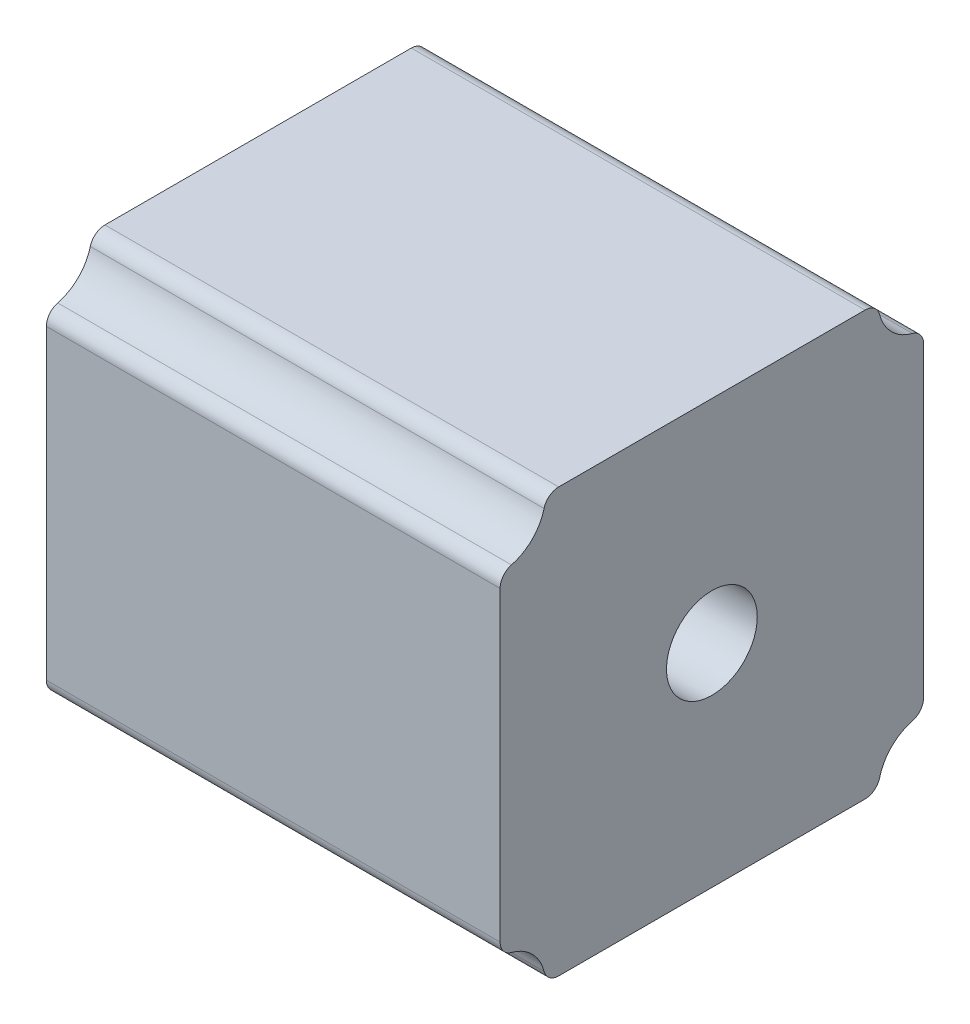
ISO-10303-21;
HEADER;
FILE_DESCRIPTION(('STEP AP214'),'2;1');
FILE_NAME('part.step','',(''),(''),'','','');
FILE_SCHEMA(('AUTOMOTIVE_DESIGN { 1 0 10303 214 1 1 1 1 }'));
ENDSEC;
DATA;
#1=APPLICATION_CONTEXT('core data for automotive mechanical design processes');
#2=APPLICATION_PROTOCOL_DEFINITION('international standard','automotive_design',2000,#1);
#3=PRODUCT_CONTEXT('',#1,'mechanical');
#4=PRODUCT('Part','Part','',(#3));
#5=PRODUCT_RELATED_PRODUCT_CATEGORY('part','',(#4));
#6=PRODUCT_DEFINITION_FORMATION('','',#4);
#7=PRODUCT_DEFINITION_CONTEXT('part definition',#1,'design');
#8=PRODUCT_DEFINITION('design','',#6,#7);
#9=PRODUCT_DEFINITION_SHAPE('','',#8);
#10=(LENGTH_UNIT() NAMED_UNIT(*) SI_UNIT(.MILLI.,.METRE.));
#11=(NAMED_UNIT(*) PLANE_ANGLE_UNIT() SI_UNIT($,.RADIAN.));
#12=(NAMED_UNIT(*) SI_UNIT($,.STERADIAN.) SOLID_ANGLE_UNIT());
#13=UNCERTAINTY_MEASURE_WITH_UNIT(LENGTH_MEASURE(1.E-05),#10,'distance_accuracy_value','');
#14=(GEOMETRIC_REPRESENTATION_CONTEXT(3) GLOBAL_UNCERTAINTY_ASSIGNED_CONTEXT((#13)) GLOBAL_UNIT_ASSIGNED_CONTEXT((#10,
#11,#12)) REPRESENTATION_CONTEXT('',''));
#15=CARTESIAN_POINT('',(0.,0.,0.));
#16=DIRECTION('',(0.,0.,1.));
#17=DIRECTION('',(1.,0.,0.));
#18=AXIS2_PLACEMENT_3D('',#15,#16,#17);
#19=CARTESIAN_POINT('',(-30.,10.1270166537926,13.));
#20=DIRECTION('',(1.,0.,0.));
#21=DIRECTION('',(0.,0.,-1.));
#22=AXIS2_PLACEMENT_3D('',#19,#20,#21);
#23=CYLINDRICAL_SURFACE('',#22,1.);
#24=CARTESIAN_POINT('',(0.,10.1270166537926,13.));
#25=DIRECTION('',(1.,0.,0.));
#26=DIRECTION('',(0.,0.,-1.));
#27=AXIS2_PLACEMENT_3D('',#24,#25,#26);
#28=CIRCLE('',#27,1.);
#29=CARTESIAN_POINT('',(0.,11.0952624903444,13.25));
#30=VERTEX_POINT('',#29);
#31=CARTESIAN_POINT('',(0.,10.1270166537926,14.));
#32=VERTEX_POINT('',#31);
#33=EDGE_CURVE('E184',#30,#32,#28,.T.);
#34=ORIENTED_EDGE('',*,*,#33,.F.);
#35=DIRECTION('',(1.,0.,0.));
#36=VECTOR('',#35,1.);
#37=CARTESIAN_POINT('',(-30.,11.0952624903444,13.25));
#38=LINE('',#37,#36);
#39=CARTESIAN_POINT('',(-30.,11.0952624903444,13.25));
#40=VERTEX_POINT('',#39);
#41=EDGE_CURVE('E11',#40,#30,#38,.T.);
#42=ORIENTED_EDGE('',*,*,#41,.F.);
#43=CARTESIAN_POINT('',(-30.,10.1270166537926,13.));
#44=DIRECTION('',(1.,0.,0.));
#45=DIRECTION('',(0.,0.,-1.));
#46=AXIS2_PLACEMENT_3D('',#43,#44,#45);
#47=CIRCLE('',#46,1.);
#48=CARTESIAN_POINT('',(-30.,10.1270166537926,14.));
#49=VERTEX_POINT('',#48);
#50=EDGE_CURVE('E229',#40,#49,#47,.T.);
#51=ORIENTED_EDGE('',*,*,#50,.T.);
#52=DIRECTION('',(1.,0.,0.));
#53=VECTOR('',#52,1.);
#54=CARTESIAN_POINT('',(-30.,10.1270166537926,14.));
#55=LINE('',#54,#53);
#56=EDGE_CURVE('E42',#49,#32,#55,.T.);
#57=ORIENTED_EDGE('',*,*,#56,.T.);
#58=EDGE_LOOP('',(#34,#42,#51,#57));
#59=FACE_BOUND('',#58,.T.);
#60=ADVANCED_FACE('F39',(#59),#23,.T.);
#61=CARTESIAN_POINT('',(-30.,14.,14.));
#62=DIRECTION('',(1.,0.,0.));
#63=DIRECTION('',(0.,0.,-1.));
#64=AXIS2_PLACEMENT_3D('',#61,#62,#63);
#65=CYLINDRICAL_SURFACE('',#64,3.);
#66=CARTESIAN_POINT('',(0.,14.,14.));
#67=DIRECTION('',(-1.,0.,0.));
#68=DIRECTION('',(0.,0.,-1.));
#69=AXIS2_PLACEMENT_3D('',#66,#67,#68);
#70=CIRCLE('',#69,3.);
#71=CARTESIAN_POINT('',(0.,13.25,11.0952624903444));
#72=VERTEX_POINT('',#71);
#73=EDGE_CURVE('E227',#72,#30,#70,.T.);
#74=ORIENTED_EDGE('',*,*,#73,.F.);
#75=DIRECTION('',(1.,0.,0.));
#76=VECTOR('',#75,1.);
#77=CARTESIAN_POINT('',(-30.,13.25,11.0952624903444));
#78=LINE('',#77,#76);
#79=CARTESIAN_POINT('',(-30.,13.25,11.0952624903444));
#80=VERTEX_POINT('',#79);
#81=EDGE_CURVE('E48',#80,#72,#78,.T.);
#82=ORIENTED_EDGE('',*,*,#81,.F.);
#83=CARTESIAN_POINT('',(-30.,14.,14.));
#84=DIRECTION('',(-1.,0.,0.));
#85=DIRECTION('',(0.,0.,-1.));
#86=AXIS2_PLACEMENT_3D('',#83,#84,#85);
#87=CIRCLE('',#86,3.);
#88=EDGE_CURVE('E174',#80,#40,#87,.T.);
#89=ORIENTED_EDGE('',*,*,#88,.T.);
#90=ORIENTED_EDGE('',*,*,#41,.T.);
#91=EDGE_LOOP('',(#74,#82,#89,#90));
#92=FACE_BOUND('',#91,.T.);
#93=ADVANCED_FACE('F257',(#92),#65,.F.);
#94=CARTESIAN_POINT('',(-30.,13.,10.1270166537926));
#95=DIRECTION('',(1.,0.,0.));
#96=DIRECTION('',(0.,0.,-1.));
#97=AXIS2_PLACEMENT_3D('',#94,#95,#96);
#98=CYLINDRICAL_SURFACE('',#97,0.999999999999999);
#99=CARTESIAN_POINT('',(0.,13.,10.1270166537926));
#100=DIRECTION('',(1.,0.,0.));
#101=DIRECTION('',(0.,0.,-1.));
#102=AXIS2_PLACEMENT_3D('',#99,#100,#101);
#103=CIRCLE('',#102,0.999999999999999);
#104=CARTESIAN_POINT('',(0.,14.,10.1270166537926));
#105=VERTEX_POINT('',#104);
#106=EDGE_CURVE('E161',#105,#72,#103,.T.);
#107=ORIENTED_EDGE('',*,*,#106,.F.);
#108=DIRECTION('',(1.,0.,0.));
#109=VECTOR('',#108,1.);
#110=CARTESIAN_POINT('',(-30.,14.,10.1270166537926));
#111=LINE('',#110,#109);
#112=CARTESIAN_POINT('',(-30.,14.,10.1270166537926));
#113=VERTEX_POINT('',#112);
#114=EDGE_CURVE('E156',#113,#105,#111,.T.);
#115=ORIENTED_EDGE('',*,*,#114,.F.);
#116=CARTESIAN_POINT('',(-30.,13.,10.1270166537926));
#117=DIRECTION('',(1.,0.,0.));
#118=DIRECTION('',(0.,0.,-1.));
#119=AXIS2_PLACEMENT_3D('',#116,#117,#118);
#120=CIRCLE('',#119,0.999999999999999);
#121=EDGE_CURVE('E159',#113,#80,#120,.T.);
#122=ORIENTED_EDGE('',*,*,#121,.T.);
#123=ORIENTED_EDGE('',*,*,#81,.T.);
#124=EDGE_LOOP('',(#107,#115,#122,#123));
#125=FACE_BOUND('',#124,.T.);
#126=ADVANCED_FACE('F158',(#125),#98,.T.);
#127=CARTESIAN_POINT('',(-30.,14.,-10.1270166537933));
#128=DIRECTION('',(0.,1.,0.));
#129=DIRECTION('',(0.,0.,1.));
#130=AXIS2_PLACEMENT_3D('',#127,#128,#129);
#131=PLANE('',#130);
#132=DIRECTION('',(0.,0.,1.));
#133=VECTOR('',#132,1.);
#134=CARTESIAN_POINT('',(0.,14.,-10.1270166537933));
#135=LINE('',#134,#133);
#136=CARTESIAN_POINT('',(0.,14.,-10.1270166537933));
#137=VERTEX_POINT('',#136);
#138=EDGE_CURVE('E224',#137,#105,#135,.T.);
#139=ORIENTED_EDGE('',*,*,#138,.F.);
#140=DIRECTION('',(1.,0.,0.));
#141=VECTOR('',#140,1.);
#142=CARTESIAN_POINT('',(-30.,14.,-10.1270166537933));
#143=LINE('',#142,#141);
#144=CARTESIAN_POINT('',(-30.,14.,-10.1270166537933));
#145=VERTEX_POINT('',#144);
#146=EDGE_CURVE('E166',#145,#137,#143,.T.);
#147=ORIENTED_EDGE('',*,*,#146,.F.);
#148=DIRECTION('',(0.,0.,1.));
#149=VECTOR('',#148,1.);
#150=CARTESIAN_POINT('',(-30.,14.,-10.1270166537933));
#151=LINE('',#150,#149);
#152=EDGE_CURVE('E172',#145,#113,#151,.T.);
#153=ORIENTED_EDGE('',*,*,#152,.T.);
#154=ORIENTED_EDGE('',*,*,#114,.T.);
#155=EDGE_LOOP('',(#139,#147,#153,#154));
#156=FACE_BOUND('',#155,.T.);
#157=ADVANCED_FACE('F176',(#156),#131,.T.);
#158=CARTESIAN_POINT('',(-30.,13.,-10.1270166537933));
#159=DIRECTION('',(1.,0.,0.));
#160=DIRECTION('',(0.,0.,-1.));
#161=AXIS2_PLACEMENT_3D('',#158,#159,#160);
#162=CYLINDRICAL_SURFACE('',#161,0.999999999999999);
#163=CARTESIAN_POINT('',(0.,13.,-10.1270166537933));
#164=DIRECTION('',(1.,0.,0.));
#165=DIRECTION('',(0.,0.,-1.));
#166=AXIS2_PLACEMENT_3D('',#163,#164,#165);
#167=CIRCLE('',#166,0.999999999999999);
#168=CARTESIAN_POINT('',(0.,13.25,-11.0952624903451));
#169=VERTEX_POINT('',#168);
#170=EDGE_CURVE('E221',#169,#137,#167,.T.);
#171=ORIENTED_EDGE('',*,*,#170,.F.);
#172=DIRECTION('',(1.,0.,0.));
#173=VECTOR('',#172,1.);
#174=CARTESIAN_POINT('',(-30.,13.25,-11.0952624903451));
#175=LINE('',#174,#173);
#176=CARTESIAN_POINT('',(-30.,13.25,-11.0952624903451));
#177=VERTEX_POINT('',#176);
#178=EDGE_CURVE('E233',#177,#169,#175,.T.);
#179=ORIENTED_EDGE('',*,*,#178,.F.);
#180=CARTESIAN_POINT('',(-30.,13.,-10.1270166537933));
#181=DIRECTION('',(1.,0.,0.));
#182=DIRECTION('',(0.,0.,-1.));
#183=AXIS2_PLACEMENT_3D('',#180,#181,#182);
#184=CIRCLE('',#183,0.999999999999999);
#185=EDGE_CURVE('E177',#177,#145,#184,.T.);
#186=ORIENTED_EDGE('',*,*,#185,.T.);
#187=ORIENTED_EDGE('',*,*,#146,.T.);
#188=EDGE_LOOP('',(#171,#179,#186,#187));
#189=FACE_BOUND('',#188,.T.);
#190=ADVANCED_FACE('F270',(#189),#162,.T.);
#191=CARTESIAN_POINT('',(-30.,14.,-14.0000000000007));
#192=DIRECTION('',(1.,0.,0.));
#193=DIRECTION('',(0.,0.,-1.));
#194=AXIS2_PLACEMENT_3D('',#191,#192,#193);
#195=CYLINDRICAL_SURFACE('',#194,3.);
#196=CARTESIAN_POINT('',(0.,14.,-14.0000000000007));
#197=DIRECTION('',(-1.,0.,0.));
#198=DIRECTION('',(0.,0.,-1.));
#199=AXIS2_PLACEMENT_3D('',#196,#197,#198);
#200=CIRCLE('',#199,3.);
#201=CARTESIAN_POINT('',(0.,11.0952624903444,-13.2500000000007));
#202=VERTEX_POINT('',#201);
#203=EDGE_CURVE('E218',#202,#169,#200,.T.);
#204=ORIENTED_EDGE('',*,*,#203,.F.);
#205=DIRECTION('',(1.,0.,0.));
#206=VECTOR('',#205,1.);
#207=CARTESIAN_POINT('',(-30.,11.0952624903444,-13.2500000000007));
#208=LINE('',#207,#206);
#209=CARTESIAN_POINT('',(-30.,11.0952624903444,-13.2500000000007));
#210=VERTEX_POINT('',#209);
#211=EDGE_CURVE('E235',#210,#202,#208,.T.);
#212=ORIENTED_EDGE('',*,*,#211,.F.);
#213=CARTESIAN_POINT('',(-30.,14.,-14.0000000000007));
#214=DIRECTION('',(-1.,0.,0.));
#215=DIRECTION('',(0.,0.,-1.));
#216=AXIS2_PLACEMENT_3D('',#213,#214,#215);
#217=CIRCLE('',#216,3.);
#218=EDGE_CURVE('E179',#210,#177,#217,.T.);
#219=ORIENTED_EDGE('',*,*,#218,.T.);
#220=ORIENTED_EDGE('',*,*,#178,.T.);
#221=EDGE_LOOP('',(#204,#212,#219,#220));
#222=FACE_BOUND('',#221,.T.);
#223=ADVANCED_FACE('F273',(#222),#195,.F.);
#224=CARTESIAN_POINT('',(-30.,10.1270166537926,-13.0000000000007));
#225=DIRECTION('',(1.,0.,0.));
#226=DIRECTION('',(0.,0.,-1.));
#227=AXIS2_PLACEMENT_3D('',#224,#225,#226);
#228=CYLINDRICAL_SURFACE('',#227,0.999999999999999);
#229=CARTESIAN_POINT('',(0.,10.1270166537926,-13.0000000000007));
#230=DIRECTION('',(1.,0.,0.));
#231=DIRECTION('',(0.,0.,-1.));
#232=AXIS2_PLACEMENT_3D('',#229,#230,#231);
#233=CIRCLE('',#232,0.999999999999999);
#234=CARTESIAN_POINT('',(0.,10.1270166537926,-14.0000000000007));
#235=VERTEX_POINT('',#234);
#236=EDGE_CURVE('E215',#235,#202,#233,.T.);
#237=ORIENTED_EDGE('',*,*,#236,.F.);
#238=DIRECTION('',(1.,0.,0.));
#239=VECTOR('',#238,1.);
#240=CARTESIAN_POINT('',(-30.,10.1270166537926,-14.0000000000007));
#241=LINE('',#240,#239);
#242=CARTESIAN_POINT('',(-30.,10.1270166537926,-14.0000000000007));
#243=VERTEX_POINT('',#242);
#244=EDGE_CURVE('E237',#243,#235,#241,.T.);
#245=ORIENTED_EDGE('',*,*,#244,.F.);
#246=CARTESIAN_POINT('',(-30.,10.1270166537926,-13.0000000000007));
#247=DIRECTION('',(1.,0.,0.));
#248=DIRECTION('',(0.,0.,-1.));
#249=AXIS2_PLACEMENT_3D('',#246,#247,#248);
#250=CIRCLE('',#249,0.999999999999999);
#251=EDGE_CURVE('E365',#243,#210,#250,.T.);
#252=ORIENTED_EDGE('',*,*,#251,.T.);
#253=ORIENTED_EDGE('',*,*,#211,.T.);
#254=EDGE_LOOP('',(#237,#245,#252,#253));
#255=FACE_BOUND('',#254,.T.);
#256=ADVANCED_FACE('F277',(#255),#228,.T.);
#257=CARTESIAN_POINT('',(-30.,10.1270166537926,-14.0000000000007));
#258=DIRECTION('',(0.,0.,-1.));
#259=DIRECTION('',(0.,1.,0.));
#260=AXIS2_PLACEMENT_3D('',#257,#258,#259);
#261=PLANE('',#260);
#262=DIRECTION('',(0.,1.,0.));
#263=VECTOR('',#262,1.);
#264=CARTESIAN_POINT('',(0.,10.1270166537926,-14.0000000000007));
#265=LINE('',#264,#263);
#266=CARTESIAN_POINT('',(0.,-10.1270166537933,-14.0000000000007));
#267=VERTEX_POINT('',#266);
#268=EDGE_CURVE('E212',#267,#235,#265,.T.);
#269=ORIENTED_EDGE('',*,*,#268,.F.);
#270=DIRECTION('',(1.,0.,0.));
#271=VECTOR('',#270,1.);
#272=CARTESIAN_POINT('',(-30.,-10.1270166537933,-14.0000000000007));
#273=LINE('',#272,#271);
#274=CARTESIAN_POINT('',(-30.,-10.1270166537933,-14.0000000000007));
#275=VERTEX_POINT('',#274);
#276=EDGE_CURVE('E239',#275,#267,#273,.T.);
#277=ORIENTED_EDGE('',*,*,#276,.F.);
#278=DIRECTION('',(0.,1.,0.));
#279=VECTOR('',#278,1.);
#280=CARTESIAN_POINT('',(-30.,10.1270166537926,-14.0000000000007));
#281=LINE('',#280,#279);
#282=EDGE_CURVE('E362',#275,#243,#281,.T.);
#283=ORIENTED_EDGE('',*,*,#282,.T.);
#284=ORIENTED_EDGE('',*,*,#244,.T.);
#285=EDGE_LOOP('',(#269,#277,#283,#284));
#286=FACE_BOUND('',#285,.T.);
#287=ADVANCED_FACE('F281',(#286),#261,.T.);
#288=CARTESIAN_POINT('',(-30.,-10.1270166537933,-13.0000000000007));
#289=DIRECTION('',(1.,0.,0.));
#290=DIRECTION('',(0.,0.,-1.));
#291=AXIS2_PLACEMENT_3D('',#288,#289,#290);
#292=CYLINDRICAL_SURFACE('',#291,0.999999999999999);
#293=CARTESIAN_POINT('',(0.,-10.1270166537933,-13.0000000000007));
#294=DIRECTION('',(1.,0.,0.));
#295=DIRECTION('',(0.,0.,-1.));
#296=AXIS2_PLACEMENT_3D('',#293,#294,#295);
#297=CIRCLE('',#296,0.999999999999999);
#298=CARTESIAN_POINT('',(0.,-11.0952624903451,-13.2500000000007));
#299=VERTEX_POINT('',#298);
#300=EDGE_CURVE('E209',#299,#267,#297,.T.);
#301=ORIENTED_EDGE('',*,*,#300,.F.);
#302=DIRECTION('',(1.,0.,0.));
#303=VECTOR('',#302,1.);
#304=CARTESIAN_POINT('',(-30.,-11.0952624903451,-13.2500000000007));
#305=LINE('',#304,#303);
#306=CARTESIAN_POINT('',(-30.,-11.0952624903451,-13.2500000000007));
#307=VERTEX_POINT('',#306);
#308=EDGE_CURVE('E241',#307,#299,#305,.T.);
#309=ORIENTED_EDGE('',*,*,#308,.F.);
#310=CARTESIAN_POINT('',(-30.,-10.1270166537933,-13.0000000000007));
#311=DIRECTION('',(1.,0.,0.));
#312=DIRECTION('',(0.,0.,-1.));
#313=AXIS2_PLACEMENT_3D('',#310,#311,#312);
#314=CIRCLE('',#313,0.999999999999999);
#315=EDGE_CURVE('E359',#307,#275,#314,.T.);
#316=ORIENTED_EDGE('',*,*,#315,.T.);
#317=ORIENTED_EDGE('',*,*,#276,.T.);
#318=EDGE_LOOP('',(#301,#309,#316,#317));
#319=FACE_BOUND('',#318,.T.);
#320=ADVANCED_FACE('F285',(#319),#292,.T.);
#321=CARTESIAN_POINT('',(-30.,-14.0000000000007,-14.0000000000007));
#322=DIRECTION('',(1.,0.,0.));
#323=DIRECTION('',(0.,0.,-1.));
#324=AXIS2_PLACEMENT_3D('',#321,#322,#323);
#325=CYLINDRICAL_SURFACE('',#324,3.);
#326=CARTESIAN_POINT('',(0.,-14.0000000000007,-14.0000000000007));
#327=DIRECTION('',(-1.,0.,0.));
#328=DIRECTION('',(0.,0.,-1.));
#329=AXIS2_PLACEMENT_3D('',#326,#327,#328);
#330=CIRCLE('',#329,3.);
#331=CARTESIAN_POINT('',(0.,-13.2500000000007,-11.0952624903451));
#332=VERTEX_POINT('',#331);
#333=EDGE_CURVE('E206',#332,#299,#330,.T.);
#334=ORIENTED_EDGE('',*,*,#333,.F.);
#335=DIRECTION('',(1.,0.,0.));
#336=VECTOR('',#335,1.);
#337=CARTESIAN_POINT('',(-30.,-13.2500000000007,-11.0952624903451));
#338=LINE('',#337,#336);
#339=CARTESIAN_POINT('',(-30.,-13.2500000000007,-11.0952624903451));
#340=VERTEX_POINT('',#339);
#341=EDGE_CURVE('E243',#340,#332,#338,.T.);
#342=ORIENTED_EDGE('',*,*,#341,.F.);
#343=CARTESIAN_POINT('',(-30.,-14.0000000000007,-14.0000000000007));
#344=DIRECTION('',(-1.,0.,0.));
#345=DIRECTION('',(0.,0.,-1.));
#346=AXIS2_PLACEMENT_3D('',#343,#344,#345);
#347=CIRCLE('',#346,3.);
#348=EDGE_CURVE('E356',#340,#307,#347,.T.);
#349=ORIENTED_EDGE('',*,*,#348,.T.);
#350=ORIENTED_EDGE('',*,*,#308,.T.);
#351=EDGE_LOOP('',(#334,#342,#349,#350));
#352=FACE_BOUND('',#351,.T.);
#353=ADVANCED_FACE('F289',(#352),#325,.F.);
#354=CARTESIAN_POINT('',(-30.,-13.0000000000007,-10.1270166537933));
#355=DIRECTION('',(1.,0.,0.));
#356=DIRECTION('',(0.,0.,-1.));
#357=AXIS2_PLACEMENT_3D('',#354,#355,#356);
#358=CYLINDRICAL_SURFACE('',#357,0.999999999999999);
#359=CARTESIAN_POINT('',(0.,-13.0000000000007,-10.1270166537933));
#360=DIRECTION('',(1.,0.,0.));
#361=DIRECTION('',(0.,0.,-1.));
#362=AXIS2_PLACEMENT_3D('',#359,#360,#361);
#363=CIRCLE('',#362,0.999999999999999);
#364=CARTESIAN_POINT('',(0.,-14.0000000000007,-10.1270166537933));
#365=VERTEX_POINT('',#364);
#366=EDGE_CURVE('E203',#365,#332,#363,.T.);
#367=ORIENTED_EDGE('',*,*,#366,.F.);
#368=DIRECTION('',(1.,0.,0.));
#369=VECTOR('',#368,1.);
#370=CARTESIAN_POINT('',(-30.,-14.0000000000007,-10.1270166537933));
#371=LINE('',#370,#369);
#372=CARTESIAN_POINT('',(-30.,-14.0000000000007,-10.1270166537933));
#373=VERTEX_POINT('',#372);
#374=EDGE_CURVE('E245',#373,#365,#371,.T.);
#375=ORIENTED_EDGE('',*,*,#374,.F.);
#376=CARTESIAN_POINT('',(-30.,-13.0000000000007,-10.1270166537933));
#377=DIRECTION('',(1.,0.,0.));
#378=DIRECTION('',(0.,0.,-1.));
#379=AXIS2_PLACEMENT_3D('',#376,#377,#378);
#380=CIRCLE('',#379,0.999999999999999);
#381=EDGE_CURVE('E353',#373,#340,#380,.T.);
#382=ORIENTED_EDGE('',*,*,#381,.T.);
#383=ORIENTED_EDGE('',*,*,#341,.T.);
#384=EDGE_LOOP('',(#367,#375,#382,#383));
#385=FACE_BOUND('',#384,.T.);
#386=ADVANCED_FACE('F293',(#385),#358,.T.);
#387=CARTESIAN_POINT('',(-30.,-14.0000000000007,10.1270166537926));
#388=DIRECTION('',(0.,-1.,0.));
#389=DIRECTION('',(0.,0.,-1.));
#390=AXIS2_PLACEMENT_3D('',#387,#388,#389);
#391=PLANE('',#390);
#392=DIRECTION('',(0.,0.,-1.));
#393=VECTOR('',#392,1.);
#394=CARTESIAN_POINT('',(0.,-14.0000000000007,10.1270166537926));
#395=LINE('',#394,#393);
#396=CARTESIAN_POINT('',(0.,-14.0000000000007,10.1270166537926));
#397=VERTEX_POINT('',#396);
#398=EDGE_CURVE('E200',#397,#365,#395,.T.);
#399=ORIENTED_EDGE('',*,*,#398,.F.);
#400=DIRECTION('',(1.,0.,0.));
#401=VECTOR('',#400,1.);
#402=CARTESIAN_POINT('',(-30.,-14.0000000000007,10.1270166537926));
#403=LINE('',#402,#401);
#404=CARTESIAN_POINT('',(-30.,-14.0000000000007,10.1270166537926));
#405=VERTEX_POINT('',#404);
#406=EDGE_CURVE('E247',#405,#397,#403,.T.);
#407=ORIENTED_EDGE('',*,*,#406,.F.);
#408=DIRECTION('',(0.,0.,-1.));
#409=VECTOR('',#408,1.);
#410=CARTESIAN_POINT('',(-30.,-14.0000000000007,10.1270166537926));
#411=LINE('',#410,#409);
#412=EDGE_CURVE('E350',#405,#373,#411,.T.);
#413=ORIENTED_EDGE('',*,*,#412,.T.);
#414=ORIENTED_EDGE('',*,*,#374,.T.);
#415=EDGE_LOOP('',(#399,#407,#413,#414));
#416=FACE_BOUND('',#415,.T.);
#417=ADVANCED_FACE('F297',(#416),#391,.T.);
#418=CARTESIAN_POINT('',(-30.,-13.0000000000007,10.1270166537926));
#419=DIRECTION('',(1.,0.,0.));
#420=DIRECTION('',(0.,0.,-1.));
#421=AXIS2_PLACEMENT_3D('',#418,#419,#420);
#422=CYLINDRICAL_SURFACE('',#421,1.);
#423=CARTESIAN_POINT('',(0.,-13.0000000000007,10.1270166537926));
#424=DIRECTION('',(1.,0.,0.));
#425=DIRECTION('',(0.,0.,1.));
#426=AXIS2_PLACEMENT_3D('',#423,#424,#425);
#427=CIRCLE('',#426,1.);
#428=CARTESIAN_POINT('',(0.,-13.2500000000007,11.0952624903444));
#429=VERTEX_POINT('',#428);
#430=EDGE_CURVE('E197',#429,#397,#427,.T.);
#431=ORIENTED_EDGE('',*,*,#430,.F.);
#432=DIRECTION('',(1.,0.,0.));
#433=VECTOR('',#432,1.);
#434=CARTESIAN_POINT('',(-30.,-13.2500000000007,11.0952624903444));
#435=LINE('',#434,#433);
#436=CARTESIAN_POINT('',(-30.,-13.2500000000007,11.0952624903444));
#437=VERTEX_POINT('',#436);
#438=EDGE_CURVE('E249',#437,#429,#435,.T.);
#439=ORIENTED_EDGE('',*,*,#438,.F.);
#440=CARTESIAN_POINT('',(-30.,-13.0000000000007,10.1270166537926));
#441=DIRECTION('',(1.,0.,0.));
#442=DIRECTION('',(0.,0.,1.));
#443=AXIS2_PLACEMENT_3D('',#440,#441,#442);
#444=CIRCLE('',#443,1.);
#445=EDGE_CURVE('E347',#437,#405,#444,.T.);
#446=ORIENTED_EDGE('',*,*,#445,.T.);
#447=ORIENTED_EDGE('',*,*,#406,.T.);
#448=EDGE_LOOP('',(#431,#439,#446,#447));
#449=FACE_BOUND('',#448,.T.);
#450=ADVANCED_FACE('F301',(#449),#422,.T.);
#451=CARTESIAN_POINT('',(-30.,-14.0000000000007,14.));
#452=DIRECTION('',(1.,0.,0.));
#453=DIRECTION('',(0.,0.,-1.));
#454=AXIS2_PLACEMENT_3D('',#451,#452,#453);
#455=CYLINDRICAL_SURFACE('',#454,3.);
#456=CARTESIAN_POINT('',(0.,-14.0000000000007,14.));
#457=DIRECTION('',(-1.,0.,0.));
#458=DIRECTION('',(0.,0.,-1.));
#459=AXIS2_PLACEMENT_3D('',#456,#457,#458);
#460=CIRCLE('',#459,3.);
#461=CARTESIAN_POINT('',(0.,-11.0952624903451,13.25));
#462=VERTEX_POINT('',#461);
#463=EDGE_CURVE('E194',#462,#429,#460,.T.);
#464=ORIENTED_EDGE('',*,*,#463,.F.);
#465=DIRECTION('',(1.,0.,0.));
#466=VECTOR('',#465,1.);
#467=CARTESIAN_POINT('',(-30.,-11.0952624903451,13.25));
#468=LINE('',#467,#466);
#469=CARTESIAN_POINT('',(-30.,-11.0952624903451,13.25));
#470=VERTEX_POINT('',#469);
#471=EDGE_CURVE('E251',#470,#462,#468,.T.);
#472=ORIENTED_EDGE('',*,*,#471,.F.);
#473=CARTESIAN_POINT('',(-30.,-14.0000000000007,14.));
#474=DIRECTION('',(-1.,0.,0.));
#475=DIRECTION('',(0.,0.,-1.));
#476=AXIS2_PLACEMENT_3D('',#473,#474,#475);
#477=CIRCLE('',#476,3.);
#478=EDGE_CURVE('E344',#470,#437,#477,.T.);
#479=ORIENTED_EDGE('',*,*,#478,.T.);
#480=ORIENTED_EDGE('',*,*,#438,.T.);
#481=EDGE_LOOP('',(#464,#472,#479,#480));
#482=FACE_BOUND('',#481,.T.);
#483=ADVANCED_FACE('F305',(#482),#455,.F.);
#484=CARTESIAN_POINT('',(-30.,-10.1270166537933,13.));
#485=DIRECTION('',(1.,0.,0.));
#486=DIRECTION('',(0.,0.,-1.));
#487=AXIS2_PLACEMENT_3D('',#484,#485,#486);
#488=CYLINDRICAL_SURFACE('',#487,1.);
#489=CARTESIAN_POINT('',(0.,-10.1270166537933,13.));
#490=DIRECTION('',(1.,0.,0.));
#491=DIRECTION('',(0.,0.,1.));
#492=AXIS2_PLACEMENT_3D('',#489,#490,#491);
#493=CIRCLE('',#492,1.);
#494=CARTESIAN_POINT('',(0.,-10.1270166537933,14.));
#495=VERTEX_POINT('',#494);
#496=EDGE_CURVE('E191',#495,#462,#493,.T.);
#497=ORIENTED_EDGE('',*,*,#496,.F.);
#498=DIRECTION('',(1.,0.,0.));
#499=VECTOR('',#498,1.);
#500=CARTESIAN_POINT('',(-30.,-10.1270166537933,14.));
#501=LINE('',#500,#499);
#502=CARTESIAN_POINT('',(-30.,-10.1270166537933,14.));
#503=VERTEX_POINT('',#502);
#504=EDGE_CURVE('E252',#503,#495,#501,.T.);
#505=ORIENTED_EDGE('',*,*,#504,.F.);
#506=CARTESIAN_POINT('',(-30.,-10.1270166537933,13.));
#507=DIRECTION('',(1.,0.,0.));
#508=DIRECTION('',(0.,0.,1.));
#509=AXIS2_PLACEMENT_3D('',#506,#507,#508);
#510=CIRCLE('',#509,1.);
#511=EDGE_CURVE('E341',#503,#470,#510,.T.);
#512=ORIENTED_EDGE('',*,*,#511,.T.);
#513=ORIENTED_EDGE('',*,*,#471,.T.);
#514=EDGE_LOOP('',(#497,#505,#512,#513));
#515=FACE_BOUND('',#514,.T.);
#516=ADVANCED_FACE('F309',(#515),#488,.T.);
#517=CARTESIAN_POINT('',(-30.,10.1270166537926,14.));
#518=DIRECTION('',(0.,0.,1.));
#519=DIRECTION('',(0.,-1.,0.));
#520=AXIS2_PLACEMENT_3D('',#517,#518,#519);
#521=PLANE('',#520);
#522=DIRECTION('',(0.,-1.,0.));
#523=VECTOR('',#522,1.);
#524=CARTESIAN_POINT('',(0.,10.1270166537926,14.));
#525=LINE('',#524,#523);
#526=EDGE_CURVE('E187',#32,#495,#525,.T.);
#527=ORIENTED_EDGE('',*,*,#526,.F.);
#528=ORIENTED_EDGE('',*,*,#56,.F.);
#529=DIRECTION('',(0.,-1.,0.));
#530=VECTOR('',#529,1.);
#531=CARTESIAN_POINT('',(-30.,10.1270166537926,14.));
#532=LINE('',#531,#530);
#533=EDGE_CURVE('E339',#49,#503,#532,.T.);
#534=ORIENTED_EDGE('',*,*,#533,.T.);
#535=ORIENTED_EDGE('',*,*,#504,.T.);
#536=EDGE_LOOP('',(#527,#528,#534,#535));
#537=FACE_BOUND('',#536,.T.);
#538=ADVANCED_FACE('F254',(#537),#521,.T.);
#539=CARTESIAN_POINT('',(-30.,10.1270166537926,13.));
#540=DIRECTION('',(1.,0.,0.));
#541=DIRECTION('',(0.,0.,-1.));
#542=AXIS2_PLACEMENT_3D('',#539,#540,#541);
#543=PLANE('',#542);
#544=ORIENTED_EDGE('',*,*,#50,.F.);
#545=ORIENTED_EDGE('',*,*,#88,.F.);
#546=ORIENTED_EDGE('',*,*,#121,.F.);
#547=ORIENTED_EDGE('',*,*,#152,.F.);
#548=ORIENTED_EDGE('',*,*,#185,.F.);
#549=ORIENTED_EDGE('',*,*,#218,.F.);
#550=ORIENTED_EDGE('',*,*,#251,.F.);
#551=ORIENTED_EDGE('',*,*,#282,.F.);
#552=ORIENTED_EDGE('',*,*,#315,.F.);
#553=ORIENTED_EDGE('',*,*,#348,.F.);
#554=ORIENTED_EDGE('',*,*,#381,.F.);
#555=ORIENTED_EDGE('',*,*,#412,.F.);
#556=ORIENTED_EDGE('',*,*,#445,.F.);
#557=ORIENTED_EDGE('',*,*,#478,.F.);
#558=ORIENTED_EDGE('',*,*,#511,.F.);
#559=ORIENTED_EDGE('',*,*,#533,.F.);
#560=EDGE_LOOP('',(#544,#545,#546,#547,#548,#549,#550,#551,#552,#553,#554,#555,#556,#557,#558,#559));
#561=FACE_BOUND('',#560,.T.);
#562=ADVANCED_FACE('F170',(#561),#543,.F.);
#563=CARTESIAN_POINT('',(0.,10.1270166537926,13.));
#564=DIRECTION('',(1.,0.,0.));
#565=DIRECTION('',(0.,0.,-1.));
#566=AXIS2_PLACEMENT_3D('',#563,#564,#565);
#567=PLANE('',#566);
#568=CARTESIAN_POINT('',(0.,0.,0.));
#569=DIRECTION('',(1.,0.,0.));
#570=DIRECTION('',(0.,0.,-1.));
#571=AXIS2_PLACEMENT_3D('',#568,#569,#570);
#572=CIRCLE('',#571,3.);
#573=CARTESIAN_POINT('',(0.,0.,-3.));
#574=VERTEX_POINT('',#573);
#575=EDGE_CURVE('E333',#574,#574,#572,.T.);
#576=ORIENTED_EDGE('',*,*,#575,.F.);
#577=EDGE_LOOP('',(#576));
#578=FACE_BOUND('',#577,.T.);
#579=ORIENTED_EDGE('',*,*,#33,.T.);
#580=ORIENTED_EDGE('',*,*,#526,.T.);
#581=ORIENTED_EDGE('',*,*,#496,.T.);
#582=ORIENTED_EDGE('',*,*,#463,.T.);
#583=ORIENTED_EDGE('',*,*,#430,.T.);
#584=ORIENTED_EDGE('',*,*,#398,.T.);
#585=ORIENTED_EDGE('',*,*,#366,.T.);
#586=ORIENTED_EDGE('',*,*,#333,.T.);
#587=ORIENTED_EDGE('',*,*,#300,.T.);
#588=ORIENTED_EDGE('',*,*,#268,.T.);
#589=ORIENTED_EDGE('',*,*,#236,.T.);
#590=ORIENTED_EDGE('',*,*,#203,.T.);
#591=ORIENTED_EDGE('',*,*,#170,.T.);
#592=ORIENTED_EDGE('',*,*,#138,.T.);
#593=ORIENTED_EDGE('',*,*,#106,.T.);
#594=ORIENTED_EDGE('',*,*,#73,.T.);
#595=EDGE_LOOP('',(#579,#580,#581,#582,#583,#584,#585,#586,#587,#588,#589,#590,#591,#592,#593,#594));
#596=FACE_BOUND('',#595,.T.);
#597=ADVANCED_FACE('F256',(#578,#596),#567,.T.);
#598=CARTESIAN_POINT('',(-5.,0.,0.));
#599=DIRECTION('',(1.,0.,0.));
#600=DIRECTION('',(0.,0.,-1.));
#601=AXIS2_PLACEMENT_3D('',#598,#599,#600);
#602=CYLINDRICAL_SURFACE('',#601,3.);
#603=CARTESIAN_POINT('',(-5.,0.,0.));
#604=DIRECTION('',(1.,0.,0.));
#605=DIRECTION('',(0.,0.,-1.));
#606=AXIS2_PLACEMENT_3D('',#603,#604,#605);
#607=CIRCLE('',#606,3.);
#608=CARTESIAN_POINT('',(-5.,0.,-3.));
#609=VERTEX_POINT('',#608);
#610=EDGE_CURVE('E188',#609,#609,#607,.T.);
#611=ORIENTED_EDGE('',*,*,#610,.F.);
#612=EDGE_LOOP('',(#611));
#613=FACE_BOUND('',#612,.T.);
#614=ORIENTED_EDGE('',*,*,#575,.T.);
#615=EDGE_LOOP('',(#614));
#616=FACE_BOUND('',#615,.T.);
#617=ADVANCED_FACE('F320',(#613,#616),#602,.F.);
#618=CARTESIAN_POINT('',(-5.,0.,0.));
#619=DIRECTION('',(1.,0.,0.));
#620=DIRECTION('',(0.,0.,-1.));
#621=AXIS2_PLACEMENT_3D('',#618,#619,#620);
#622=PLANE('',#621);
#623=ORIENTED_EDGE('',*,*,#610,.T.);
#624=EDGE_LOOP('',(#623));
#625=FACE_BOUND('',#624,.T.);
#626=ADVANCED_FACE('F325',(#625),#622,.T.);
#627=CLOSED_SHELL('',(#60,#93,#126,#157,#190,#223,#256,#287,#320,#353,#386,#417,#450,#483,#516,
#538,#562,#597,#617,#626));
#628=MANIFOLD_SOLID_BREP('B2',#627);
#629=ADVANCED_BREP_SHAPE_REPRESENTATION('',(#18,#628),#14);
#630=SHAPE_DEFINITION_REPRESENTATION(#9,#629);
ENDSEC;
END-ISO-10303-21;
